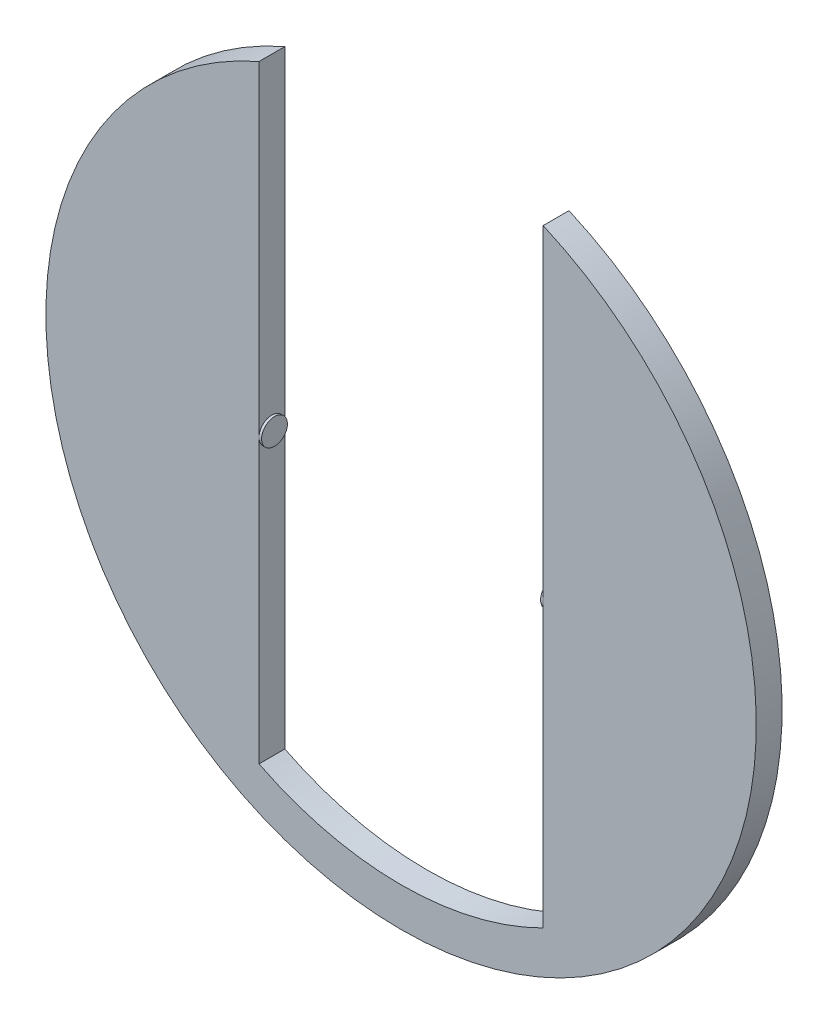
ISO-10303-21;
HEADER;
FILE_DESCRIPTION(('STEP AP214'),'2;1');
FILE_NAME('part.step','',(''),(''),'','','');
FILE_SCHEMA(('AUTOMOTIVE_DESIGN { 1 0 10303 214 1 1 1 1 }'));
ENDSEC;
DATA;
#1=APPLICATION_CONTEXT('core data for automotive mechanical design processes');
#2=APPLICATION_PROTOCOL_DEFINITION('international standard','automotive_design',2000,#1);
#3=PRODUCT_CONTEXT('',#1,'mechanical');
#4=PRODUCT('Part','Part','',(#3));
#5=PRODUCT_RELATED_PRODUCT_CATEGORY('part','',(#4));
#6=PRODUCT_DEFINITION_FORMATION('','',#4);
#7=PRODUCT_DEFINITION_CONTEXT('part definition',#1,'design');
#8=PRODUCT_DEFINITION('design','',#6,#7);
#9=PRODUCT_DEFINITION_SHAPE('','',#8);
#10=(LENGTH_UNIT() NAMED_UNIT(*) SI_UNIT(.MILLI.,.METRE.));
#11=(NAMED_UNIT(*) PLANE_ANGLE_UNIT() SI_UNIT($,.RADIAN.));
#12=(NAMED_UNIT(*) SI_UNIT($,.STERADIAN.) SOLID_ANGLE_UNIT());
#13=UNCERTAINTY_MEASURE_WITH_UNIT(LENGTH_MEASURE(1.E-05),#10,'distance_accuracy_value','');
#14=(GEOMETRIC_REPRESENTATION_CONTEXT(3) GLOBAL_UNCERTAINTY_ASSIGNED_CONTEXT((#13)) GLOBAL_UNIT_ASSIGNED_CONTEXT((#10,
#11,#12)) REPRESENTATION_CONTEXT('',''));
#15=CARTESIAN_POINT('',(0.,0.,0.));
#16=DIRECTION('',(0.,0.,1.));
#17=DIRECTION('',(1.,0.,0.));
#18=AXIS2_PLACEMENT_3D('',#15,#16,#17);
#19=CARTESIAN_POINT('',(110.,0.,20.));
#20=DIRECTION('',(1.,0.,0.));
#21=DIRECTION('',(0.,1.,0.));
#22=AXIS2_PLACEMENT_3D('',#19,#20,#21);
#23=PLANE('',#22);
#24=DIRECTION('',(0.,-1.,0.));
#25=VECTOR('',#24,1.);
#26=CARTESIAN_POINT('',(110.,0.,20.));
#27=LINE('',#26,#25);
#28=CARTESIAN_POINT('',(110.,0.,20.));
#29=VERTEX_POINT('',#28);
#30=CARTESIAN_POINT('',(110.,-218.917792789896,20.));
#31=VERTEX_POINT('',#30);
#32=EDGE_CURVE('E97',#29,#31,#27,.T.);
#33=ORIENTED_EDGE('',*,*,#32,.F.);
#34=CARTESIAN_POINT('',(110.,0.,10.));
#35=DIRECTION('',(1.,0.,0.));
#36=DIRECTION('',(0.,1.,0.));
#37=AXIS2_PLACEMENT_3D('',#34,#35,#36);
#38=CIRCLE('',#37,10.);
#39=CARTESIAN_POINT('',(110.,0.,0.));
#40=VERTEX_POINT('',#39);
#41=EDGE_CURVE('E49',#29,#40,#38,.T.);
#42=ORIENTED_EDGE('',*,*,#41,.T.);
#43=DIRECTION('',(0.,-1.,0.));
#44=VECTOR('',#43,1.);
#45=CARTESIAN_POINT('',(110.,0.,0.));
#46=LINE('',#45,#44);
#47=CARTESIAN_POINT('',(110.,-218.917792789896,0.));
#48=VERTEX_POINT('',#47);
#49=EDGE_CURVE('E95',#40,#48,#46,.T.);
#50=ORIENTED_EDGE('',*,*,#49,.T.);
#51=DIRECTION('',(0.,0.,-1.));
#52=VECTOR('',#51,1.);
#53=CARTESIAN_POINT('',(110.,-218.917792789896,20.));
#54=LINE('',#53,#52);
#55=EDGE_CURVE('E121',#31,#48,#54,.T.);
#56=ORIENTED_EDGE('',*,*,#55,.F.);
#57=EDGE_LOOP('',(#33,#42,#50,#56));
#58=FACE_BOUND('',#57,.T.);
#59=ADVANCED_FACE('F35',(#58),#23,.F.);
#60=CARTESIAN_POINT('',(-110.,0.,20.));
#61=DIRECTION('',(1.,0.,0.));
#62=DIRECTION('',(0.,1.,0.));
#63=AXIS2_PLACEMENT_3D('',#60,#61,#62);
#64=PLANE('',#63);
#65=DIRECTION('',(0.,-1.,0.));
#66=VECTOR('',#65,1.);
#67=CARTESIAN_POINT('',(-110.,0.,0.));
#68=LINE('',#67,#66);
#69=CARTESIAN_POINT('',(-110.,0.,0.));
#70=VERTEX_POINT('',#69);
#71=CARTESIAN_POINT('',(-110.,-218.917792789896,0.));
#72=VERTEX_POINT('',#71);
#73=EDGE_CURVE('E137',#70,#72,#68,.T.);
#74=ORIENTED_EDGE('',*,*,#73,.F.);
#75=CARTESIAN_POINT('',(-110.,0.,10.));
#76=DIRECTION('',(1.,0.,0.));
#77=DIRECTION('',(0.,1.,0.));
#78=AXIS2_PLACEMENT_3D('',#75,#76,#77);
#79=CIRCLE('',#78,10.);
#80=CARTESIAN_POINT('',(-110.,0.,20.));
#81=VERTEX_POINT('',#80);
#82=EDGE_CURVE('E56',#81,#70,#79,.T.);
#83=ORIENTED_EDGE('',*,*,#82,.F.);
#84=DIRECTION('',(0.,-1.,0.));
#85=VECTOR('',#84,1.);
#86=CARTESIAN_POINT('',(-110.,0.,20.));
#87=LINE('',#86,#85);
#88=CARTESIAN_POINT('',(-110.,-218.917792789896,20.));
#89=VERTEX_POINT('',#88);
#90=EDGE_CURVE('E116',#81,#89,#87,.T.);
#91=ORIENTED_EDGE('',*,*,#90,.T.);
#92=DIRECTION('',(0.,0.,-1.));
#93=VECTOR('',#92,1.);
#94=CARTESIAN_POINT('',(-110.,-218.917792789896,20.));
#95=LINE('',#94,#93);
#96=EDGE_CURVE('E11',#89,#72,#95,.T.);
#97=ORIENTED_EDGE('',*,*,#96,.T.);
#98=EDGE_LOOP('',(#74,#83,#91,#97));
#99=FACE_BOUND('',#98,.T.);
#100=ADVANCED_FACE('F154',(#99),#64,.T.);
#101=CARTESIAN_POINT('',(0.,0.,20.));
#102=DIRECTION('',(0.,0.,-1.));
#103=DIRECTION('',(-1.,0.,0.));
#104=AXIS2_PLACEMENT_3D('',#101,#102,#103);
#105=CYLINDRICAL_SURFACE('',#104,245.);
#106=CARTESIAN_POINT('',(0.,0.,0.));
#107=DIRECTION('',(0.,0.,1.));
#108=DIRECTION('',(1.,0.,0.));
#109=AXIS2_PLACEMENT_3D('',#106,#107,#108);
#110=CIRCLE('',#109,245.);
#111=EDGE_CURVE('E107',#72,#48,#110,.T.);
#112=ORIENTED_EDGE('',*,*,#111,.F.);
#113=ORIENTED_EDGE('',*,*,#96,.F.);
#114=CARTESIAN_POINT('',(0.,0.,20.));
#115=DIRECTION('',(0.,0.,1.));
#116=DIRECTION('',(1.,0.,0.));
#117=AXIS2_PLACEMENT_3D('',#114,#115,#116);
#118=CIRCLE('',#117,245.);
#119=EDGE_CURVE('E114',#89,#31,#118,.T.);
#120=ORIENTED_EDGE('',*,*,#119,.T.);
#121=ORIENTED_EDGE('',*,*,#55,.T.);
#122=EDGE_LOOP('',(#112,#113,#120,#121));
#123=FACE_BOUND('',#122,.T.);
#124=ADVANCED_FACE('F37',(#123),#105,.F.);
#125=CARTESIAN_POINT('',(-110.,252.041663222571,20.));
#126=VERTEX_POINT('',#125);
#127=EDGE_CURVE('E143',#126,#81,#87,.T.);
#128=ORIENTED_EDGE('',*,*,#127,.T.);
#129=EDGE_CURVE('E135',#70,#81,#79,.T.);
#130=ORIENTED_EDGE('',*,*,#129,.F.);
#131=CARTESIAN_POINT('',(-110.,252.041663222571,0.));
#132=VERTEX_POINT('',#131);
#133=EDGE_CURVE('E133',#132,#70,#68,.T.);
#134=ORIENTED_EDGE('',*,*,#133,.F.);
#135=DIRECTION('',(0.,0.,-1.));
#136=VECTOR('',#135,1.);
#137=CARTESIAN_POINT('',(-110.,252.041663222571,20.));
#138=LINE('',#137,#136);
#139=EDGE_CURVE('E43',#126,#132,#138,.T.);
#140=ORIENTED_EDGE('',*,*,#139,.F.);
#141=EDGE_LOOP('',(#128,#130,#134,#140));
#142=FACE_BOUND('',#141,.T.);
#143=ADVANCED_FACE('F134',(#142),#64,.T.);
#144=CARTESIAN_POINT('',(0.,0.,20.));
#145=DIRECTION('',(0.,0.,-1.));
#146=DIRECTION('',(-1.,0.,0.));
#147=AXIS2_PLACEMENT_3D('',#144,#145,#146);
#148=CYLINDRICAL_SURFACE('',#147,275.);
#149=CARTESIAN_POINT('',(0.,0.,0.));
#150=DIRECTION('',(0.,0.,1.));
#151=DIRECTION('',(1.,0.,0.));
#152=AXIS2_PLACEMENT_3D('',#149,#150,#151);
#153=CIRCLE('',#152,275.);
#154=CARTESIAN_POINT('',(110.,252.041663222571,0.));
#155=VERTEX_POINT('',#154);
#156=EDGE_CURVE('E108',#132,#155,#153,.T.);
#157=ORIENTED_EDGE('',*,*,#156,.T.);
#158=DIRECTION('',(0.,0.,-1.));
#159=VECTOR('',#158,1.);
#160=CARTESIAN_POINT('',(110.,252.041663222571,20.));
#161=LINE('',#160,#159);
#162=CARTESIAN_POINT('',(110.,252.041663222571,20.));
#163=VERTEX_POINT('',#162);
#164=EDGE_CURVE('E113',#163,#155,#161,.T.);
#165=ORIENTED_EDGE('',*,*,#164,.F.);
#166=CARTESIAN_POINT('',(0.,0.,20.));
#167=DIRECTION('',(0.,0.,1.));
#168=DIRECTION('',(1.,0.,0.));
#169=AXIS2_PLACEMENT_3D('',#166,#167,#168);
#170=CIRCLE('',#169,275.);
#171=EDGE_CURVE('E127',#126,#163,#170,.T.);
#172=ORIENTED_EDGE('',*,*,#171,.F.);
#173=ORIENTED_EDGE('',*,*,#139,.T.);
#174=EDGE_LOOP('',(#157,#165,#172,#173));
#175=FACE_BOUND('',#174,.T.);
#176=ADVANCED_FACE('F126',(#175),#148,.T.);
#177=EDGE_CURVE('E105',#155,#40,#46,.T.);
#178=ORIENTED_EDGE('',*,*,#177,.T.);
#179=EDGE_CURVE('E85',#40,#29,#38,.T.);
#180=ORIENTED_EDGE('',*,*,#179,.T.);
#181=EDGE_CURVE('E123',#163,#29,#27,.T.);
#182=ORIENTED_EDGE('',*,*,#181,.F.);
#183=ORIENTED_EDGE('',*,*,#164,.T.);
#184=EDGE_LOOP('',(#178,#180,#182,#183));
#185=FACE_BOUND('',#184,.T.);
#186=ADVANCED_FACE('F111',(#185),#23,.F.);
#187=CARTESIAN_POINT('',(0.,0.,20.));
#188=DIRECTION('',(0.,0.,1.));
#189=DIRECTION('',(1.,0.,0.));
#190=AXIS2_PLACEMENT_3D('',#187,#188,#189);
#191=PLANE('',#190);
#192=ORIENTED_EDGE('',*,*,#119,.F.);
#193=ORIENTED_EDGE('',*,*,#90,.F.);
#194=ORIENTED_EDGE('',*,*,#127,.F.);
#195=ORIENTED_EDGE('',*,*,#171,.T.);
#196=ORIENTED_EDGE('',*,*,#181,.T.);
#197=ORIENTED_EDGE('',*,*,#32,.T.);
#198=EDGE_LOOP('',(#192,#193,#194,#195,#196,#197));
#199=FACE_BOUND('',#198,.T.);
#200=ADVANCED_FACE('F158',(#199),#191,.T.);
#201=CARTESIAN_POINT('',(0.,0.,0.));
#202=DIRECTION('',(0.,0.,1.));
#203=DIRECTION('',(1.,0.,0.));
#204=AXIS2_PLACEMENT_3D('',#201,#202,#203);
#205=PLANE('',#204);
#206=ORIENTED_EDGE('',*,*,#111,.T.);
#207=ORIENTED_EDGE('',*,*,#49,.F.);
#208=ORIENTED_EDGE('',*,*,#177,.F.);
#209=ORIENTED_EDGE('',*,*,#156,.F.);
#210=ORIENTED_EDGE('',*,*,#133,.T.);
#211=ORIENTED_EDGE('',*,*,#73,.T.);
#212=EDGE_LOOP('',(#206,#207,#208,#209,#210,#211));
#213=FACE_BOUND('',#212,.T.);
#214=ADVANCED_FACE('F103',(#213),#205,.F.);
#215=CARTESIAN_POINT('',(-108.,0.,10.));
#216=DIRECTION('',(-1.,0.,0.));
#217=DIRECTION('',(0.,-1.,0.));
#218=AXIS2_PLACEMENT_3D('',#215,#216,#217);
#219=CYLINDRICAL_SURFACE('',#218,10.);
#220=CARTESIAN_POINT('',(-108.,0.,10.));
#221=DIRECTION('',(1.,0.,0.));
#222=DIRECTION('',(0.,1.,0.));
#223=AXIS2_PLACEMENT_3D('',#220,#221,#222);
#224=CIRCLE('',#223,10.);
#225=CARTESIAN_POINT('',(-108.,9.99999999999999,10.));
#226=VERTEX_POINT('',#225);
#227=EDGE_CURVE('E140',#226,#226,#224,.T.);
#228=ORIENTED_EDGE('',*,*,#227,.F.);
#229=EDGE_LOOP('',(#228));
#230=FACE_BOUND('',#229,.T.);
#231=ORIENTED_EDGE('',*,*,#82,.T.);
#232=ORIENTED_EDGE('',*,*,#129,.T.);
#233=EDGE_LOOP('',(#231,#232));
#234=FACE_BOUND('',#233,.T.);
#235=ADVANCED_FACE('F151',(#230,#234),#219,.T.);
#236=CARTESIAN_POINT('',(-108.,0.,10.));
#237=DIRECTION('',(1.,0.,0.));
#238=DIRECTION('',(0.,1.,0.));
#239=AXIS2_PLACEMENT_3D('',#236,#237,#238);
#240=PLANE('',#239);
#241=ORIENTED_EDGE('',*,*,#227,.T.);
#242=EDGE_LOOP('',(#241));
#243=FACE_BOUND('',#242,.T.);
#244=ADVANCED_FACE('F196',(#243),#240,.T.);
#245=CARTESIAN_POINT('',(108.,0.,10.));
#246=DIRECTION('',(1.,0.,0.));
#247=DIRECTION('',(0.,1.,0.));
#248=AXIS2_PLACEMENT_3D('',#245,#246,#247);
#249=CYLINDRICAL_SURFACE('',#248,10.);
#250=CARTESIAN_POINT('',(108.,0.,10.));
#251=DIRECTION('',(1.,0.,0.));
#252=DIRECTION('',(0.,1.,0.));
#253=AXIS2_PLACEMENT_3D('',#250,#251,#252);
#254=CIRCLE('',#253,10.);
#255=CARTESIAN_POINT('',(108.,9.99999999999999,10.));
#256=VERTEX_POINT('',#255);
#257=EDGE_CURVE('E99',#256,#256,#254,.T.);
#258=ORIENTED_EDGE('',*,*,#257,.T.);
#259=EDGE_LOOP('',(#258));
#260=FACE_BOUND('',#259,.T.);
#261=ORIENTED_EDGE('',*,*,#41,.F.);
#262=ORIENTED_EDGE('',*,*,#179,.F.);
#263=EDGE_LOOP('',(#261,#262));
#264=FACE_BOUND('',#263,.T.);
#265=ADVANCED_FACE('F86',(#260,#264),#249,.T.);
#266=CARTESIAN_POINT('',(108.,0.,10.));
#267=DIRECTION('',(-1.,0.,0.));
#268=DIRECTION('',(0.,1.,0.));
#269=AXIS2_PLACEMENT_3D('',#266,#267,#268);
#270=PLANE('',#269);
#271=ORIENTED_EDGE('',*,*,#257,.F.);
#272=EDGE_LOOP('',(#271));
#273=FACE_BOUND('',#272,.T.);
#274=ADVANCED_FACE('F240',(#273),#270,.T.);
#275=CLOSED_SHELL('',(#59,#100,#124,#143,#176,#186,#200,#214,#235,#244,#265,#274));
#276=MANIFOLD_SOLID_BREP('B2',#275);
#277=ADVANCED_BREP_SHAPE_REPRESENTATION('',(#18,#276),#14);
#278=SHAPE_DEFINITION_REPRESENTATION(#9,#277);
ENDSEC;
END-ISO-10303-21;
